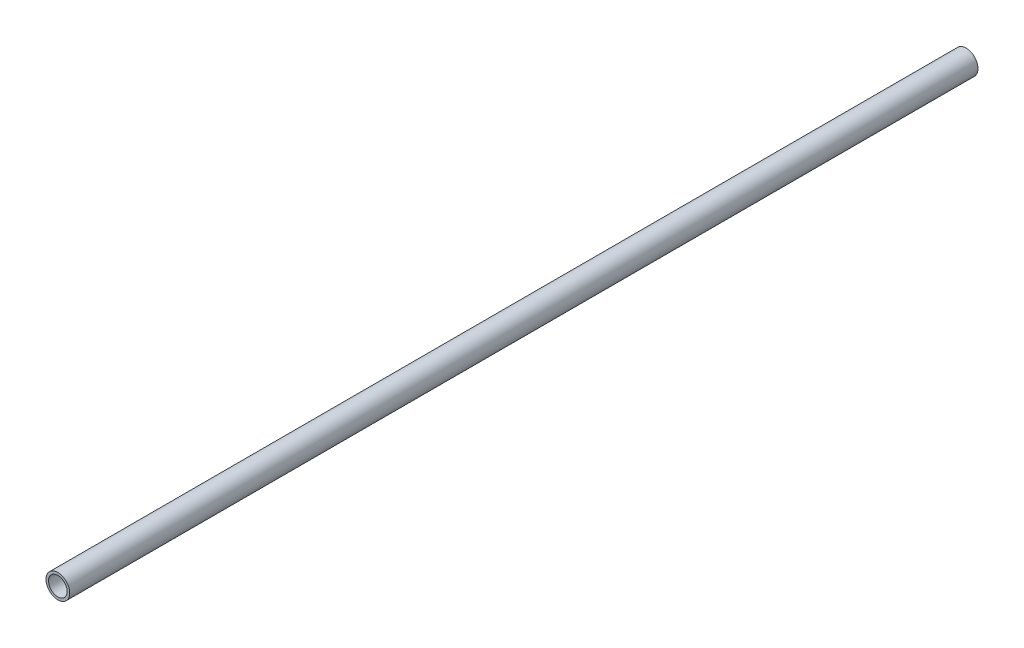
ISO-10303-21;
HEADER;
FILE_DESCRIPTION(('STEP AP214'),'2;1');
FILE_NAME('part.step','',(''),(''),'','','');
FILE_SCHEMA(('AUTOMOTIVE_DESIGN { 1 0 10303 214 1 1 1 1 }'));
ENDSEC;
DATA;
#1=APPLICATION_CONTEXT('core data for automotive mechanical design processes');
#2=APPLICATION_PROTOCOL_DEFINITION('international standard','automotive_design',2000,#1);
#3=PRODUCT_CONTEXT('',#1,'mechanical');
#4=PRODUCT('Part','Part','',(#3));
#5=PRODUCT_RELATED_PRODUCT_CATEGORY('part','',(#4));
#6=PRODUCT_DEFINITION_FORMATION('','',#4);
#7=PRODUCT_DEFINITION_CONTEXT('part definition',#1,'design');
#8=PRODUCT_DEFINITION('design','',#6,#7);
#9=PRODUCT_DEFINITION_SHAPE('','',#8);
#10=(LENGTH_UNIT() NAMED_UNIT(*) SI_UNIT(.MILLI.,.METRE.));
#11=(NAMED_UNIT(*) PLANE_ANGLE_UNIT() SI_UNIT($,.RADIAN.));
#12=(NAMED_UNIT(*) SI_UNIT($,.STERADIAN.) SOLID_ANGLE_UNIT());
#13=UNCERTAINTY_MEASURE_WITH_UNIT(LENGTH_MEASURE(1.E-05),#10,'distance_accuracy_value','');
#14=(GEOMETRIC_REPRESENTATION_CONTEXT(3) GLOBAL_UNCERTAINTY_ASSIGNED_CONTEXT((#13)) GLOBAL_UNIT_ASSIGNED_CONTEXT((#10,
#11,#12)) REPRESENTATION_CONTEXT('',''));
#15=CARTESIAN_POINT('',(0.,0.,0.));
#16=DIRECTION('',(0.,0.,1.));
#17=DIRECTION('',(1.,0.,0.));
#18=AXIS2_PLACEMENT_3D('',#15,#16,#17);
#19=CARTESIAN_POINT('',(0.,0.,850.));
#20=DIRECTION('',(0.,0.,1.));
#21=DIRECTION('',(1.,0.,0.));
#22=AXIS2_PLACEMENT_3D('',#19,#20,#21);
#23=PLANE('',#22);
#24=CARTESIAN_POINT('',(0.,0.,850.));
#25=DIRECTION('',(0.,0.,1.));
#26=DIRECTION('',(1.,0.,0.));
#27=AXIS2_PLACEMENT_3D('',#24,#25,#26);
#28=CIRCLE('',#27,11.11);
#29=CARTESIAN_POINT('',(11.11,0.,850.));
#30=VERTEX_POINT('',#29);
#31=EDGE_CURVE('E10',#30,#30,#28,.T.);
#32=ORIENTED_EDGE('',*,*,#31,.T.);
#33=EDGE_LOOP('',(#32));
#34=FACE_BOUND('',#33,.T.);
#35=CARTESIAN_POINT('',(0.,0.,850.));
#36=DIRECTION('',(0.,0.,1.));
#37=DIRECTION('',(1.,0.,0.));
#38=AXIS2_PLACEMENT_3D('',#35,#36,#37);
#39=CIRCLE('',#38,8.73);
#40=CARTESIAN_POINT('',(8.73,0.,850.));
#41=VERTEX_POINT('',#40);
#42=EDGE_CURVE('E44',#41,#41,#39,.T.);
#43=ORIENTED_EDGE('',*,*,#42,.F.);
#44=EDGE_LOOP('',(#43));
#45=FACE_BOUND('',#44,.T.);
#46=ADVANCED_FACE('F33',(#34,#45),#23,.T.);
#47=CARTESIAN_POINT('',(0.,0.,0.));
#48=DIRECTION('',(0.,0.,1.));
#49=DIRECTION('',(1.,0.,0.));
#50=AXIS2_PLACEMENT_3D('',#47,#48,#49);
#51=PLANE('',#50);
#52=CARTESIAN_POINT('',(0.,0.,0.));
#53=DIRECTION('',(0.,0.,1.));
#54=DIRECTION('',(1.,0.,0.));
#55=AXIS2_PLACEMENT_3D('',#52,#53,#54);
#56=CIRCLE('',#55,11.11);
#57=CARTESIAN_POINT('',(11.11,0.,0.));
#58=VERTEX_POINT('',#57);
#59=EDGE_CURVE('E37',#58,#58,#56,.T.);
#60=ORIENTED_EDGE('',*,*,#59,.F.);
#61=EDGE_LOOP('',(#60));
#62=FACE_BOUND('',#61,.T.);
#63=CARTESIAN_POINT('',(0.,0.,0.));
#64=DIRECTION('',(0.,0.,1.));
#65=DIRECTION('',(1.,0.,0.));
#66=AXIS2_PLACEMENT_3D('',#63,#64,#65);
#67=CIRCLE('',#66,8.73);
#68=CARTESIAN_POINT('',(8.73,0.,0.));
#69=VERTEX_POINT('',#68);
#70=EDGE_CURVE('E46',#69,#69,#67,.T.);
#71=ORIENTED_EDGE('',*,*,#70,.T.);
#72=EDGE_LOOP('',(#71));
#73=FACE_BOUND('',#72,.T.);
#74=ADVANCED_FACE('F56',(#62,#73),#51,.F.);
#75=CARTESIAN_POINT('',(0.,0.,850.));
#76=DIRECTION('',(0.,0.,-1.));
#77=DIRECTION('',(-1.,0.,0.));
#78=AXIS2_PLACEMENT_3D('',#75,#76,#77);
#79=CYLINDRICAL_SURFACE('',#78,11.11);
#80=ORIENTED_EDGE('',*,*,#31,.F.);
#81=EDGE_LOOP('',(#80));
#82=FACE_BOUND('',#81,.T.);
#83=ORIENTED_EDGE('',*,*,#59,.T.);
#84=EDGE_LOOP('',(#83));
#85=FACE_BOUND('',#84,.T.);
#86=ADVANCED_FACE('F35',(#82,#85),#79,.T.);
#87=CARTESIAN_POINT('',(0.,0.,850.));
#88=DIRECTION('',(0.,0.,-1.));
#89=DIRECTION('',(-1.,0.,0.));
#90=AXIS2_PLACEMENT_3D('',#87,#88,#89);
#91=CYLINDRICAL_SURFACE('',#90,8.73);
#92=ORIENTED_EDGE('',*,*,#42,.T.);
#93=EDGE_LOOP('',(#92));
#94=FACE_BOUND('',#93,.T.);
#95=ORIENTED_EDGE('',*,*,#70,.F.);
#96=EDGE_LOOP('',(#95));
#97=FACE_BOUND('',#96,.T.);
#98=ADVANCED_FACE('F52',(#94,#97),#91,.F.);
#99=CLOSED_SHELL('',(#46,#74,#86,#98));
#100=MANIFOLD_SOLID_BREP('B2',#99);
#101=ADVANCED_BREP_SHAPE_REPRESENTATION('',(#18,#100),#14);
#102=SHAPE_DEFINITION_REPRESENTATION(#9,#101);
ENDSEC;
END-ISO-10303-21;
